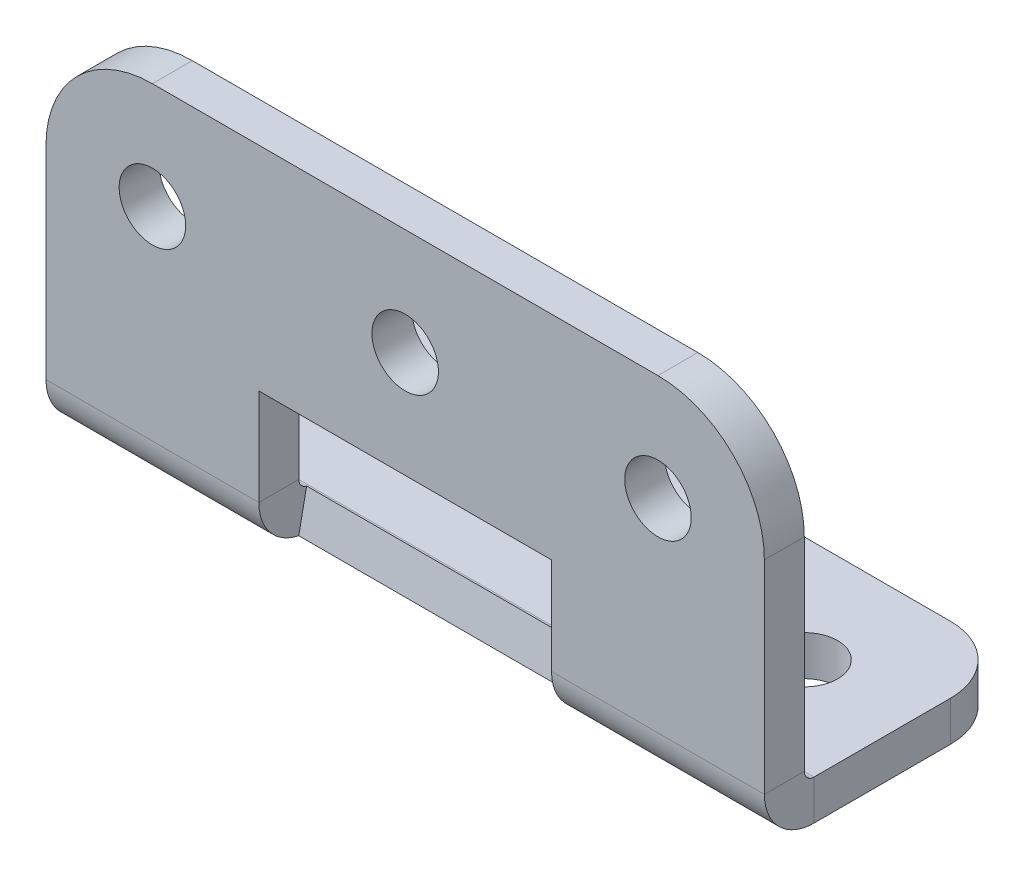
ISO-10303-21;
HEADER;
FILE_DESCRIPTION(('STEP AP214'),'2;1');
FILE_NAME('part.step','',(''),(''),'','','');
FILE_SCHEMA(('AUTOMOTIVE_DESIGN { 1 0 10303 214 1 1 1 1 }'));
ENDSEC;
DATA;
#1=APPLICATION_CONTEXT('core data for automotive mechanical design processes');
#2=APPLICATION_PROTOCOL_DEFINITION('international standard','automotive_design',2000,#1);
#3=PRODUCT_CONTEXT('',#1,'mechanical');
#4=PRODUCT('Part','Part','',(#3));
#5=PRODUCT_RELATED_PRODUCT_CATEGORY('part','',(#4));
#6=PRODUCT_DEFINITION_FORMATION('','',#4);
#7=PRODUCT_DEFINITION_CONTEXT('part definition',#1,'design');
#8=PRODUCT_DEFINITION('design','',#6,#7);
#9=PRODUCT_DEFINITION_SHAPE('','',#8);
#10=(LENGTH_UNIT() NAMED_UNIT(*) SI_UNIT(.MILLI.,.METRE.));
#11=(NAMED_UNIT(*) PLANE_ANGLE_UNIT() SI_UNIT($,.RADIAN.));
#12=(NAMED_UNIT(*) SI_UNIT($,.STERADIAN.) SOLID_ANGLE_UNIT());
#13=UNCERTAINTY_MEASURE_WITH_UNIT(LENGTH_MEASURE(1.E-05),#10,'distance_accuracy_value','');
#14=(GEOMETRIC_REPRESENTATION_CONTEXT(3) GLOBAL_UNCERTAINTY_ASSIGNED_CONTEXT((#13)) GLOBAL_UNIT_ASSIGNED_CONTEXT((#10,
#11,#12)) REPRESENTATION_CONTEXT('',''));
#15=CARTESIAN_POINT('',(0.,0.,0.));
#16=DIRECTION('',(0.,0.,1.));
#17=DIRECTION('',(1.,0.,0.));
#18=AXIS2_PLACEMENT_3D('',#15,#16,#17);
#19=CARTESIAN_POINT('',(54.,24.,3.));
#20=DIRECTION('',(-1.,0.,0.));
#21=DIRECTION('',(0.,0.,1.));
#22=AXIS2_PLACEMENT_3D('',#19,#20,#21);
#23=PLANE('',#22);
#24=DIRECTION('',(0.,0.,1.));
#25=VECTOR('',#24,1.);
#26=CARTESIAN_POINT('',(54.,16.,-7.));
#27=LINE('',#26,#25);
#28=CARTESIAN_POINT('',(54.,16.,3.));
#29=VERTEX_POINT('',#28);
#30=CARTESIAN_POINT('',(54.,16.,0.));
#31=VERTEX_POINT('',#30);
#32=EDGE_CURVE('E86',#29,#31,#27,.F.);
#33=ORIENTED_EDGE('',*,*,#32,.F.);
#34=DIRECTION('',(0.,1.,0.));
#35=VECTOR('',#34,1.);
#36=CARTESIAN_POINT('',(54.,24.,3.));
#37=LINE('',#36,#35);
#38=CARTESIAN_POINT('',(54.,0.736599999999997,3.));
#39=VERTEX_POINT('',#38);
#40=EDGE_CURVE('E250',#39,#29,#37,.T.);
#41=ORIENTED_EDGE('',*,*,#40,.F.);
#42=DIRECTION('',(0.,0.,1.));
#43=VECTOR('',#42,1.);
#44=CARTESIAN_POINT('',(54.,0.736599999999997,0.));
#45=LINE('',#44,#43);
#46=CARTESIAN_POINT('',(54.,0.736599999999997,0.));
#47=VERTEX_POINT('',#46);
#48=EDGE_CURVE('E240',#47,#39,#45,.T.);
#49=ORIENTED_EDGE('',*,*,#48,.F.);
#50=DIRECTION('',(0.,1.,0.));
#51=VECTOR('',#50,1.);
#52=CARTESIAN_POINT('',(54.,24.,0.));
#53=LINE('',#52,#51);
#54=EDGE_CURVE('E259',#47,#31,#53,.T.);
#55=ORIENTED_EDGE('',*,*,#54,.T.);
#56=EDGE_LOOP('',(#33,#41,#49,#55));
#57=FACE_BOUND('',#56,.T.);
#58=ADVANCED_FACE('F77',(#57),#23,.F.);
#59=CARTESIAN_POINT('',(54.,0.736599999999997,-0.736599999999999));
#60=DIRECTION('',(1.,0.,0.));
#61=DIRECTION('',(0.,0.,1.));
#62=AXIS2_PLACEMENT_3D('',#59,#60,#61);
#63=CYLINDRICAL_SURFACE('',#62,3.7366);
#64=DIRECTION('',(-1.,0.,0.));
#65=VECTOR('',#64,1.);
#66=CARTESIAN_POINT('',(38.,-2.92667722128697,0.));
#67=LINE('',#66,#65);
#68=CARTESIAN_POINT('',(38.,-2.92667722128697,0.));
#69=VERTEX_POINT('',#68);
#70=CARTESIAN_POINT('',(16.,-2.92667722128697,0.));
#71=VERTEX_POINT('',#70);
#72=EDGE_CURVE('E366',#69,#71,#67,.T.);
#73=ORIENTED_EDGE('',*,*,#72,.T.);
#74=CARTESIAN_POINT('',(16.,0.736599999999999,-0.736599999999998));
#75=DIRECTION('',(-1.,0.,0.));
#76=DIRECTION('',(0.,0.,1.));
#77=AXIS2_PLACEMENT_3D('',#74,#75,#76);
#78=CIRCLE('',#77,3.7366);
#79=CARTESIAN_POINT('',(16.,0.736600000000011,3.));
#80=VERTEX_POINT('',#79);
#81=EDGE_CURVE('E234',#71,#80,#78,.T.);
#82=ORIENTED_EDGE('',*,*,#81,.T.);
#83=DIRECTION('',(-1.,0.,0.));
#84=VECTOR('',#83,1.);
#85=CARTESIAN_POINT('',(0.,0.736599999999997,3.));
#86=LINE('',#85,#84);
#87=CARTESIAN_POINT('',(0.,0.736599999999997,3.));
#88=VERTEX_POINT('',#87);
#89=EDGE_CURVE('E242',#80,#88,#86,.T.);
#90=ORIENTED_EDGE('',*,*,#89,.T.);
#91=CARTESIAN_POINT('',(0.,0.736599999999997,-0.736599999999999));
#92=DIRECTION('',(1.,0.,0.));
#93=DIRECTION('',(0.,0.,-1.));
#94=AXIS2_PLACEMENT_3D('',#91,#92,#93);
#95=CIRCLE('',#94,3.7366);
#96=CARTESIAN_POINT('',(0.,-3.,-0.736599999999999));
#97=VERTEX_POINT('',#96);
#98=EDGE_CURVE('E267',#97,#88,#95,.F.);
#99=ORIENTED_EDGE('',*,*,#98,.F.);
#100=DIRECTION('',(1.,0.,0.));
#101=VECTOR('',#100,1.);
#102=CARTESIAN_POINT('',(54.,-3.,-0.736599999999998));
#103=LINE('',#102,#101);
#104=CARTESIAN_POINT('',(54.,-3.,-0.736599999999998));
#105=VERTEX_POINT('',#104);
#106=EDGE_CURVE('E264',#105,#97,#103,.F.);
#107=ORIENTED_EDGE('',*,*,#106,.F.);
#108=CARTESIAN_POINT('',(54.,0.736599999999997,-0.736599999999999));
#109=DIRECTION('',(1.,0.,0.));
#110=DIRECTION('',(0.,0.,-1.));
#111=AXIS2_PLACEMENT_3D('',#108,#109,#110);
#112=CIRCLE('',#111,3.7366);
#113=EDGE_CURVE('E268',#39,#105,#112,.T.);
#114=ORIENTED_EDGE('',*,*,#113,.F.);
#115=CARTESIAN_POINT('',(38.,0.73660000000001,3.));
#116=VERTEX_POINT('',#115);
#117=EDGE_CURVE('E244',#39,#116,#86,.T.);
#118=ORIENTED_EDGE('',*,*,#117,.T.);
#119=CARTESIAN_POINT('',(38.,0.736599999999999,-0.736599999999998));
#120=DIRECTION('',(1.,0.,0.));
#121=DIRECTION('',(0.,0.,-1.));
#122=AXIS2_PLACEMENT_3D('',#119,#120,#121);
#123=CIRCLE('',#122,3.7366);
#124=EDGE_CURVE('E358',#116,#69,#123,.T.);
#125=ORIENTED_EDGE('',*,*,#124,.T.);
#126=EDGE_LOOP('',(#73,#82,#90,#99,#107,#114,#118,#125));
#127=FACE_BOUND('',#126,.T.);
#128=ADVANCED_FACE('F376',(#127),#63,.T.);
#129=CARTESIAN_POINT('',(54.,0.736599999999997,-0.736599999999999));
#130=DIRECTION('',(1.,0.,0.));
#131=DIRECTION('',(0.,0.,1.));
#132=AXIS2_PLACEMENT_3D('',#129,#130,#131);
#133=CYLINDRICAL_SURFACE('',#132,0.736599999999999);
#134=CARTESIAN_POINT('',(16.,0.736599999999999,-0.736599999999998));
#135=DIRECTION('',(-1.,0.,0.));
#136=DIRECTION('',(0.,0.,1.));
#137=AXIS2_PLACEMENT_3D('',#134,#135,#136);
#138=CIRCLE('',#137,0.7366);
#139=CARTESIAN_POINT('',(16.,0.0144541986832981,-0.591393245196166));
#140=VERTEX_POINT('',#139);
#141=CARTESIAN_POINT('',(16.,0.736600000000011,0.));
#142=VERTEX_POINT('',#141);
#143=EDGE_CURVE('E369',#140,#142,#138,.T.);
#144=ORIENTED_EDGE('',*,*,#143,.F.);
#145=DIRECTION('',(-1.,0.,0.));
#146=VECTOR('',#145,1.);
#147=CARTESIAN_POINT('',(81.1687528871473,0.0144541986832981,-0.591393245196166));
#148=LINE('',#147,#146);
#149=CARTESIAN_POINT('',(38.,0.0144541986832981,-0.591393245196166));
#150=VERTEX_POINT('',#149);
#151=EDGE_CURVE('E361',#150,#140,#148,.T.);
#152=ORIENTED_EDGE('',*,*,#151,.F.);
#153=CARTESIAN_POINT('',(38.,0.736599999999999,-0.736599999999998));
#154=DIRECTION('',(-1.,0.,0.));
#155=DIRECTION('',(0.,0.,1.));
#156=AXIS2_PLACEMENT_3D('',#153,#154,#155);
#157=CIRCLE('',#156,0.7366);
#158=CARTESIAN_POINT('',(38.,0.736600000000011,0.));
#159=VERTEX_POINT('',#158);
#160=EDGE_CURVE('E353',#159,#150,#157,.F.);
#161=ORIENTED_EDGE('',*,*,#160,.F.);
#162=DIRECTION('',(1.,0.,0.));
#163=VECTOR('',#162,1.);
#164=CARTESIAN_POINT('',(0.,0.736599999999997,0.));
#165=LINE('',#164,#163);
#166=EDGE_CURVE('E232',#159,#47,#165,.T.);
#167=ORIENTED_EDGE('',*,*,#166,.T.);
#168=CARTESIAN_POINT('',(54.,0.736599999999997,-0.736599999999999));
#169=DIRECTION('',(1.,0.,0.));
#170=DIRECTION('',(0.,0.,-1.));
#171=AXIS2_PLACEMENT_3D('',#168,#169,#170);
#172=CIRCLE('',#171,0.736599999999999);
#173=CARTESIAN_POINT('',(54.,0.,-0.736599999999999));
#174=VERTEX_POINT('',#173);
#175=EDGE_CURVE('E257',#47,#174,#172,.T.);
#176=ORIENTED_EDGE('',*,*,#175,.T.);
#177=DIRECTION('',(1.,0.,0.));
#178=VECTOR('',#177,1.);
#179=CARTESIAN_POINT('',(54.,0.,-0.736599999999999));
#180=LINE('',#179,#178);
#181=CARTESIAN_POINT('',(0.,0.,-0.736599999999999));
#182=VERTEX_POINT('',#181);
#183=EDGE_CURVE('E277',#174,#182,#180,.F.);
#184=ORIENTED_EDGE('',*,*,#183,.T.);
#185=CARTESIAN_POINT('',(0.,0.736599999999997,-0.736599999999999));
#186=DIRECTION('',(1.,0.,0.));
#187=DIRECTION('',(0.,0.,-1.));
#188=AXIS2_PLACEMENT_3D('',#185,#186,#187);
#189=CIRCLE('',#188,0.736599999999999);
#190=CARTESIAN_POINT('',(0.,0.736599999999997,0.));
#191=VERTEX_POINT('',#190);
#192=EDGE_CURVE('E274',#182,#191,#189,.F.);
#193=ORIENTED_EDGE('',*,*,#192,.T.);
#194=EDGE_CURVE('E238',#191,#142,#165,.T.);
#195=ORIENTED_EDGE('',*,*,#194,.T.);
#196=EDGE_LOOP('',(#144,#152,#161,#167,#176,#184,#193,#195));
#197=FACE_BOUND('',#196,.T.);
#198=ADVANCED_FACE('F394',(#197),#133,.F.);
#199=CARTESIAN_POINT('',(0.,0.,3.));
#200=DIRECTION('',(0.,0.,-1.));
#201=DIRECTION('',(-1.,0.,0.));
#202=AXIS2_PLACEMENT_3D('',#199,#200,#201);
#203=PLANE('',#202);
#204=CARTESIAN_POINT('',(8.,16.,3.));
#205=DIRECTION('',(0.,0.,1.));
#206=DIRECTION('',(1.,0.,0.));
#207=AXIS2_PLACEMENT_3D('',#204,#205,#206);
#208=CIRCLE('',#207,2.5);
#209=CARTESIAN_POINT('',(10.5,16.,3.));
#210=VERTEX_POINT('',#209);
#211=EDGE_CURVE('E346',#210,#210,#208,.T.);
#212=ORIENTED_EDGE('',*,*,#211,.F.);
#213=EDGE_LOOP('',(#212));
#214=FACE_BOUND('',#213,.T.);
#215=DIRECTION('',(-1.,0.,0.));
#216=VECTOR('',#215,1.);
#217=CARTESIAN_POINT('',(0.,24.,3.));
#218=LINE('',#217,#216);
#219=CARTESIAN_POINT('',(46.,24.,3.));
#220=VERTEX_POINT('',#219);
#221=CARTESIAN_POINT('',(8.,24.,3.));
#222=VERTEX_POINT('',#221);
#223=EDGE_CURVE('E254',#220,#222,#218,.T.);
#224=ORIENTED_EDGE('',*,*,#223,.T.);
#225=CARTESIAN_POINT('',(8.,16.,3.));
#226=DIRECTION('',(0.,0.,1.));
#227=DIRECTION('',(1.,0.,0.));
#228=AXIS2_PLACEMENT_3D('',#225,#226,#227);
#229=CIRCLE('',#228,8.);
#230=CARTESIAN_POINT('',(0.,16.,3.));
#231=VERTEX_POINT('',#230);
#232=EDGE_CURVE('E384',#231,#222,#229,.F.);
#233=ORIENTED_EDGE('',*,*,#232,.F.);
#234=DIRECTION('',(0.,-1.,0.));
#235=VECTOR('',#234,1.);
#236=CARTESIAN_POINT('',(0.,0.,3.));
#237=LINE('',#236,#235);
#238=EDGE_CURVE('E248',#231,#88,#237,.T.);
#239=ORIENTED_EDGE('',*,*,#238,.T.);
#240=ORIENTED_EDGE('',*,*,#89,.F.);
#241=DIRECTION('',(0.,1.,0.));
#242=VECTOR('',#241,1.);
#243=CARTESIAN_POINT('',(16.,-26.,3.));
#244=LINE('',#243,#242);
#245=CARTESIAN_POINT('',(16.,8.00000000000001,3.));
#246=VERTEX_POINT('',#245);
#247=EDGE_CURVE('E229',#80,#246,#244,.T.);
#248=ORIENTED_EDGE('',*,*,#247,.T.);
#249=DIRECTION('',(1.,0.,0.));
#250=VECTOR('',#249,1.);
#251=CARTESIAN_POINT('',(16.,8.00000000000001,3.));
#252=LINE('',#251,#250);
#253=CARTESIAN_POINT('',(38.,8.00000000000001,3.));
#254=VERTEX_POINT('',#253);
#255=EDGE_CURVE('E208',#246,#254,#252,.T.);
#256=ORIENTED_EDGE('',*,*,#255,.T.);
#257=DIRECTION('',(0.,1.,0.));
#258=VECTOR('',#257,1.);
#259=CARTESIAN_POINT('',(38.,-26.,3.));
#260=LINE('',#259,#258);
#261=EDGE_CURVE('E99',#116,#254,#260,.T.);
#262=ORIENTED_EDGE('',*,*,#261,.F.);
#263=ORIENTED_EDGE('',*,*,#117,.F.);
#264=ORIENTED_EDGE('',*,*,#40,.T.);
#265=CARTESIAN_POINT('',(46.,16.,3.));
#266=DIRECTION('',(0.,0.,1.));
#267=DIRECTION('',(1.,0.,0.));
#268=AXIS2_PLACEMENT_3D('',#265,#266,#267);
#269=CIRCLE('',#268,8.);
#270=EDGE_CURVE('E406',#220,#29,#269,.F.);
#271=ORIENTED_EDGE('',*,*,#270,.F.);
#272=EDGE_LOOP('',(#224,#233,#239,#240,#248,#256,#262,#263,#264,#271));
#273=FACE_BOUND('',#272,.T.);
#274=CARTESIAN_POINT('',(46.,16.,3.));
#275=DIRECTION('',(0.,0.,1.));
#276=DIRECTION('',(1.,0.,0.));
#277=AXIS2_PLACEMENT_3D('',#274,#275,#276);
#278=CIRCLE('',#277,2.5);
#279=CARTESIAN_POINT('',(48.5,16.,3.));
#280=VERTEX_POINT('',#279);
#281=EDGE_CURVE('E413',#280,#280,#278,.T.);
#282=ORIENTED_EDGE('',*,*,#281,.F.);
#283=EDGE_LOOP('',(#282));
#284=FACE_BOUND('',#283,.T.);
#285=CARTESIAN_POINT('',(27.,16.,3.));
#286=DIRECTION('',(0.,0.,1.));
#287=DIRECTION('',(1.,0.,0.));
#288=AXIS2_PLACEMENT_3D('',#285,#286,#287);
#289=CIRCLE('',#288,2.5);
#290=CARTESIAN_POINT('',(29.5,16.,3.));
#291=VERTEX_POINT('',#290);
#292=EDGE_CURVE('E637',#291,#291,#289,.T.);
#293=ORIENTED_EDGE('',*,*,#292,.F.);
#294=EDGE_LOOP('',(#293));
#295=FACE_BOUND('',#294,.T.);
#296=ADVANCED_FACE('F380',(#214,#273,#284,#295),#203,.F.);
#297=CARTESIAN_POINT('',(0.,0.,0.));
#298=DIRECTION('',(0.,0.,-1.));
#299=DIRECTION('',(-1.,0.,0.));
#300=AXIS2_PLACEMENT_3D('',#297,#298,#299);
#301=PLANE('',#300);
#302=CARTESIAN_POINT('',(8.,16.,0.));
#303=DIRECTION('',(0.,0.,-1.));
#304=DIRECTION('',(-1.,0.,0.));
#305=AXIS2_PLACEMENT_3D('',#302,#303,#304);
#306=CIRCLE('',#305,8.);
#307=CARTESIAN_POINT('',(8.,24.,0.));
#308=VERTEX_POINT('',#307);
#309=CARTESIAN_POINT('',(0.,16.,0.));
#310=VERTEX_POINT('',#309);
#311=EDGE_CURVE('E337',#308,#310,#306,.F.);
#312=ORIENTED_EDGE('',*,*,#311,.F.);
#313=DIRECTION('',(-1.,0.,0.));
#314=VECTOR('',#313,1.);
#315=CARTESIAN_POINT('',(0.,24.,0.));
#316=LINE('',#315,#314);
#317=CARTESIAN_POINT('',(46.,24.,0.));
#318=VERTEX_POINT('',#317);
#319=EDGE_CURVE('E251',#318,#308,#316,.T.);
#320=ORIENTED_EDGE('',*,*,#319,.F.);
#321=CARTESIAN_POINT('',(46.,16.,0.));
#322=DIRECTION('',(0.,0.,-1.));
#323=DIRECTION('',(-1.,0.,0.));
#324=AXIS2_PLACEMENT_3D('',#321,#322,#323);
#325=CIRCLE('',#324,8.);
#326=EDGE_CURVE('E342',#31,#318,#325,.F.);
#327=ORIENTED_EDGE('',*,*,#326,.F.);
#328=ORIENTED_EDGE('',*,*,#54,.F.);
#329=ORIENTED_EDGE('',*,*,#166,.F.);
#330=DIRECTION('',(0.,1.,0.));
#331=VECTOR('',#330,1.);
#332=CARTESIAN_POINT('',(38.,0.,0.));
#333=LINE('',#332,#331);
#334=CARTESIAN_POINT('',(38.,8.00000000000001,0.));
#335=VERTEX_POINT('',#334);
#336=EDGE_CURVE('E223',#159,#335,#333,.T.);
#337=ORIENTED_EDGE('',*,*,#336,.T.);
#338=DIRECTION('',(1.,0.,0.));
#339=VECTOR('',#338,1.);
#340=CARTESIAN_POINT('',(16.,8.00000000000001,0.));
#341=LINE('',#340,#339);
#342=CARTESIAN_POINT('',(16.,8.00000000000001,0.));
#343=VERTEX_POINT('',#342);
#344=EDGE_CURVE('E206',#343,#335,#341,.T.);
#345=ORIENTED_EDGE('',*,*,#344,.F.);
#346=DIRECTION('',(0.,1.,0.));
#347=VECTOR('',#346,1.);
#348=CARTESIAN_POINT('',(16.,0.,0.));
#349=LINE('',#348,#347);
#350=EDGE_CURVE('E220',#142,#343,#349,.T.);
#351=ORIENTED_EDGE('',*,*,#350,.F.);
#352=ORIENTED_EDGE('',*,*,#194,.F.);
#353=DIRECTION('',(0.,-1.,0.));
#354=VECTOR('',#353,1.);
#355=CARTESIAN_POINT('',(0.,0.,0.));
#356=LINE('',#355,#354);
#357=EDGE_CURVE('E247',#310,#191,#356,.T.);
#358=ORIENTED_EDGE('',*,*,#357,.F.);
#359=EDGE_LOOP('',(#312,#320,#327,#328,#329,#337,#345,#351,#352,#358));
#360=FACE_BOUND('',#359,.T.);
#361=CARTESIAN_POINT('',(8.,16.,0.));
#362=DIRECTION('',(0.,0.,-1.));
#363=DIRECTION('',(-1.,0.,0.));
#364=AXIS2_PLACEMENT_3D('',#361,#362,#363);
#365=CIRCLE('',#364,2.5);
#366=CARTESIAN_POINT('',(5.5,16.,0.));
#367=VERTEX_POINT('',#366);
#368=EDGE_CURVE('E81',#367,#367,#365,.T.);
#369=ORIENTED_EDGE('',*,*,#368,.F.);
#370=EDGE_LOOP('',(#369));
#371=FACE_BOUND('',#370,.T.);
#372=CARTESIAN_POINT('',(46.,16.,0.));
#373=DIRECTION('',(0.,0.,-1.));
#374=DIRECTION('',(-1.,0.,0.));
#375=AXIS2_PLACEMENT_3D('',#372,#373,#374);
#376=CIRCLE('',#375,2.5);
#377=CARTESIAN_POINT('',(43.5,16.,0.));
#378=VERTEX_POINT('',#377);
#379=EDGE_CURVE('E335',#378,#378,#376,.T.);
#380=ORIENTED_EDGE('',*,*,#379,.F.);
#381=EDGE_LOOP('',(#380));
#382=FACE_BOUND('',#381,.T.);
#383=CARTESIAN_POINT('',(27.,16.,0.));
#384=DIRECTION('',(0.,0.,1.));
#385=DIRECTION('',(1.,0.,0.));
#386=AXIS2_PLACEMENT_3D('',#383,#384,#385);
#387=CIRCLE('',#386,2.5);
#388=CARTESIAN_POINT('',(29.5,16.,0.));
#389=VERTEX_POINT('',#388);
#390=EDGE_CURVE('E634',#389,#389,#387,.T.);
#391=ORIENTED_EDGE('',*,*,#390,.T.);
#392=EDGE_LOOP('',(#391));
#393=FACE_BOUND('',#392,.T.);
#394=ADVANCED_FACE('F217',(#360,#371,#382,#393),#301,.T.);
#395=CARTESIAN_POINT('',(0.,24.,3.));
#396=DIRECTION('',(0.,-1.,0.));
#397=DIRECTION('',(0.,0.,-1.));
#398=AXIS2_PLACEMENT_3D('',#395,#396,#397);
#399=PLANE('',#398);
#400=ORIENTED_EDGE('',*,*,#223,.F.);
#401=DIRECTION('',(0.,0.,1.));
#402=VECTOR('',#401,1.);
#403=CARTESIAN_POINT('',(46.,24.,-7.));
#404=LINE('',#403,#402);
#405=EDGE_CURVE('E403',#318,#220,#404,.T.);
#406=ORIENTED_EDGE('',*,*,#405,.F.);
#407=ORIENTED_EDGE('',*,*,#319,.T.);
#408=DIRECTION('',(0.,0.,1.));
#409=VECTOR('',#408,1.);
#410=CARTESIAN_POINT('',(8.,24.,-7.));
#411=LINE('',#410,#409);
#412=EDGE_CURVE('E401',#308,#222,#411,.T.);
#413=ORIENTED_EDGE('',*,*,#412,.T.);
#414=EDGE_LOOP('',(#400,#406,#407,#413));
#415=FACE_BOUND('',#414,.T.);
#416=ADVANCED_FACE('F400',(#415),#399,.F.);
#417=CARTESIAN_POINT('',(54.,-3.,0.));
#418=DIRECTION('',(1.,0.,0.));
#419=DIRECTION('',(0.,0.,-1.));
#420=AXIS2_PLACEMENT_3D('',#417,#418,#419);
#421=PLANE('',#420);
#422=DIRECTION('',(0.,0.,-1.));
#423=VECTOR('',#422,1.);
#424=CARTESIAN_POINT('',(54.,0.,0.));
#425=LINE('',#424,#423);
#426=CARTESIAN_POINT('',(54.,0.,-11.));
#427=VERTEX_POINT('',#426);
#428=EDGE_CURVE('E317',#174,#427,#425,.T.);
#429=ORIENTED_EDGE('',*,*,#428,.F.);
#430=DIRECTION('',(0.,-1.,0.));
#431=VECTOR('',#430,1.);
#432=CARTESIAN_POINT('',(54.,0.,-0.736599999999999));
#433=LINE('',#432,#431);
#434=EDGE_CURVE('E271',#174,#105,#433,.T.);
#435=ORIENTED_EDGE('',*,*,#434,.T.);
#436=DIRECTION('',(0.,0.,-1.));
#437=VECTOR('',#436,1.);
#438=CARTESIAN_POINT('',(54.,-3.,0.));
#439=LINE('',#438,#437);
#440=CARTESIAN_POINT('',(54.,-3.,-11.));
#441=VERTEX_POINT('',#440);
#442=EDGE_CURVE('E302',#105,#441,#439,.T.);
#443=ORIENTED_EDGE('',*,*,#442,.T.);
#444=DIRECTION('',(0.,1.,0.));
#445=VECTOR('',#444,1.);
#446=CARTESIAN_POINT('',(54.,-3.,-11.));
#447=LINE('',#446,#445);
#448=EDGE_CURVE('E314',#441,#427,#447,.T.);
#449=ORIENTED_EDGE('',*,*,#448,.T.);
#450=EDGE_LOOP('',(#429,#435,#443,#449));
#451=FACE_BOUND('',#450,.T.);
#452=ADVANCED_FACE('F460',(#451),#421,.T.);
#453=CARTESIAN_POINT('',(4.99999999999999,-3.,-11.));
#454=DIRECTION('',(0.,-1.,0.));
#455=DIRECTION('',(0.,0.,-1.));
#456=AXIS2_PLACEMENT_3D('',#453,#454,#455);
#457=PLANE('',#456);
#458=CARTESIAN_POINT('',(46.,-3.,-8.00000000000001));
#459=DIRECTION('',(0.,1.,0.));
#460=DIRECTION('',(0.,0.,-1.));
#461=AXIS2_PLACEMENT_3D('',#458,#459,#460);
#462=CIRCLE('',#461,2.5);
#463=CARTESIAN_POINT('',(46.,-3.,-10.5));
#464=VERTEX_POINT('',#463);
#465=EDGE_CURVE('E287',#464,#464,#462,.T.);
#466=ORIENTED_EDGE('',*,*,#465,.T.);
#467=EDGE_LOOP('',(#466));
#468=FACE_BOUND('',#467,.T.);
#469=CARTESIAN_POINT('',(8.,-3.,-8.));
#470=DIRECTION('',(0.,1.,0.));
#471=DIRECTION('',(0.,0.,1.));
#472=AXIS2_PLACEMENT_3D('',#469,#470,#471);
#473=CIRCLE('',#472,2.5);
#474=CARTESIAN_POINT('',(8.,-3.,-5.5));
#475=VERTEX_POINT('',#474);
#476=EDGE_CURVE('E293',#475,#475,#473,.T.);
#477=ORIENTED_EDGE('',*,*,#476,.T.);
#478=EDGE_LOOP('',(#477));
#479=FACE_BOUND('',#478,.T.);
#480=ORIENTED_EDGE('',*,*,#442,.F.);
#481=ORIENTED_EDGE('',*,*,#106,.T.);
#482=DIRECTION('',(0.,0.,1.));
#483=VECTOR('',#482,1.);
#484=CARTESIAN_POINT('',(0.,-3.,0.));
#485=LINE('',#484,#483);
#486=CARTESIAN_POINT('',(0.,-3.,-11.));
#487=VERTEX_POINT('',#486);
#488=EDGE_CURVE('E299',#487,#97,#485,.T.);
#489=ORIENTED_EDGE('',*,*,#488,.F.);
#490=CARTESIAN_POINT('',(4.99999999999999,-3.,-11.));
#491=DIRECTION('',(0.,1.,0.));
#492=DIRECTION('',(0.,0.,-1.));
#493=AXIS2_PLACEMENT_3D('',#490,#491,#492);
#494=CIRCLE('',#493,5.);
#495=CARTESIAN_POINT('',(4.99999999999999,-3.,-16.));
#496=VERTEX_POINT('',#495);
#497=EDGE_CURVE('E311',#496,#487,#494,.T.);
#498=ORIENTED_EDGE('',*,*,#497,.F.);
#499=DIRECTION('',(-1.,0.,0.));
#500=VECTOR('',#499,1.);
#501=CARTESIAN_POINT('',(4.99999999999999,-3.,-16.));
#502=LINE('',#501,#500);
#503=CARTESIAN_POINT('',(49.,-3.,-16.));
#504=VERTEX_POINT('',#503);
#505=EDGE_CURVE('E308',#504,#496,#502,.T.);
#506=ORIENTED_EDGE('',*,*,#505,.F.);
#507=CARTESIAN_POINT('',(49.,-3.,-11.));
#508=DIRECTION('',(0.,1.,0.));
#509=DIRECTION('',(0.,0.,-1.));
#510=AXIS2_PLACEMENT_3D('',#507,#508,#509);
#511=CIRCLE('',#510,5.);
#512=EDGE_CURVE('E305',#441,#504,#511,.T.);
#513=ORIENTED_EDGE('',*,*,#512,.F.);
#514=EDGE_LOOP('',(#480,#481,#489,#498,#506,#513));
#515=FACE_BOUND('',#514,.T.);
#516=ADVANCED_FACE('F456',(#468,#479,#515),#457,.T.);
#517=CARTESIAN_POINT('',(4.99999999999999,0.,-11.));
#518=DIRECTION('',(0.,-1.,0.));
#519=DIRECTION('',(0.,0.,-1.));
#520=AXIS2_PLACEMENT_3D('',#517,#518,#519);
#521=PLANE('',#520);
#522=CARTESIAN_POINT('',(8.,0.,-8.));
#523=DIRECTION('',(0.,1.,0.));
#524=DIRECTION('',(0.,0.,1.));
#525=AXIS2_PLACEMENT_3D('',#522,#523,#524);
#526=CIRCLE('',#525,2.5);
#527=CARTESIAN_POINT('',(8.,0.,-5.5));
#528=VERTEX_POINT('',#527);
#529=EDGE_CURVE('E290',#528,#528,#526,.T.);
#530=ORIENTED_EDGE('',*,*,#529,.F.);
#531=EDGE_LOOP('',(#530));
#532=FACE_BOUND('',#531,.T.);
#533=CARTESIAN_POINT('',(46.,0.,-8.00000000000001));
#534=DIRECTION('',(0.,1.,0.));
#535=DIRECTION('',(0.,0.,-1.));
#536=AXIS2_PLACEMENT_3D('',#533,#534,#535);
#537=CIRCLE('',#536,2.5);
#538=CARTESIAN_POINT('',(46.,0.,-10.5));
#539=VERTEX_POINT('',#538);
#540=EDGE_CURVE('E284',#539,#539,#537,.T.);
#541=ORIENTED_EDGE('',*,*,#540,.F.);
#542=EDGE_LOOP('',(#541));
#543=FACE_BOUND('',#542,.T.);
#544=ORIENTED_EDGE('',*,*,#183,.F.);
#545=ORIENTED_EDGE('',*,*,#428,.T.);
#546=CARTESIAN_POINT('',(49.,0.,-11.));
#547=DIRECTION('',(0.,1.,0.));
#548=DIRECTION('',(0.,0.,-1.));
#549=AXIS2_PLACEMENT_3D('',#546,#547,#548);
#550=CIRCLE('',#549,5.);
#551=CARTESIAN_POINT('',(49.,0.,-16.));
#552=VERTEX_POINT('',#551);
#553=EDGE_CURVE('E319',#427,#552,#550,.T.);
#554=ORIENTED_EDGE('',*,*,#553,.T.);
#555=DIRECTION('',(-1.,0.,0.));
#556=VECTOR('',#555,1.);
#557=CARTESIAN_POINT('',(4.99999999999999,0.,-16.));
#558=LINE('',#557,#556);
#559=CARTESIAN_POINT('',(4.99999999999999,0.,-16.));
#560=VERTEX_POINT('',#559);
#561=EDGE_CURVE('E322',#552,#560,#558,.T.);
#562=ORIENTED_EDGE('',*,*,#561,.T.);
#563=CARTESIAN_POINT('',(4.99999999999999,0.,-11.));
#564=DIRECTION('',(0.,1.,0.));
#565=DIRECTION('',(0.,0.,-1.));
#566=AXIS2_PLACEMENT_3D('',#563,#564,#565);
#567=CIRCLE('',#566,5.);
#568=CARTESIAN_POINT('',(0.,0.,-11.));
#569=VERTEX_POINT('',#568);
#570=EDGE_CURVE('E303',#560,#569,#567,.T.);
#571=ORIENTED_EDGE('',*,*,#570,.T.);
#572=DIRECTION('',(0.,0.,1.));
#573=VECTOR('',#572,1.);
#574=CARTESIAN_POINT('',(0.,0.,0.));
#575=LINE('',#574,#573);
#576=EDGE_CURVE('E296',#569,#182,#575,.T.);
#577=ORIENTED_EDGE('',*,*,#576,.T.);
#578=EDGE_LOOP('',(#544,#545,#554,#562,#571,#577));
#579=FACE_BOUND('',#578,.T.);
#580=ADVANCED_FACE('F459',(#532,#543,#579),#521,.F.);
#581=CARTESIAN_POINT('',(0.,-3.,0.));
#582=DIRECTION('',(-1.,0.,0.));
#583=DIRECTION('',(0.,0.,1.));
#584=AXIS2_PLACEMENT_3D('',#581,#582,#583);
#585=PLANE('',#584);
#586=DIRECTION('',(0.,-1.,0.));
#587=VECTOR('',#586,1.);
#588=CARTESIAN_POINT('',(0.,0.,-0.736599999999999));
#589=LINE('',#588,#587);
#590=EDGE_CURVE('E281',#182,#97,#589,.T.);
#591=ORIENTED_EDGE('',*,*,#590,.F.);
#592=ORIENTED_EDGE('',*,*,#576,.F.);
#593=DIRECTION('',(0.,1.,0.));
#594=VECTOR('',#593,1.);
#595=CARTESIAN_POINT('',(0.,-3.,-11.));
#596=LINE('',#595,#594);
#597=EDGE_CURVE('E327',#487,#569,#596,.T.);
#598=ORIENTED_EDGE('',*,*,#597,.F.);
#599=ORIENTED_EDGE('',*,*,#488,.T.);
#600=EDGE_LOOP('',(#591,#592,#598,#599));
#601=FACE_BOUND('',#600,.T.);
#602=ADVANCED_FACE('F79',(#601),#585,.T.);
#603=CARTESIAN_POINT('',(4.99999999999999,-3.,-11.));
#604=DIRECTION('',(0.,1.,0.));
#605=DIRECTION('',(0.,0.,1.));
#606=AXIS2_PLACEMENT_3D('',#603,#604,#605);
#607=CYLINDRICAL_SURFACE('',#606,5.);
#608=ORIENTED_EDGE('',*,*,#570,.F.);
#609=DIRECTION('',(0.,1.,0.));
#610=VECTOR('',#609,1.);
#611=CARTESIAN_POINT('',(4.99999999999999,-3.,-16.));
#612=LINE('',#611,#610);
#613=EDGE_CURVE('E329',#496,#560,#612,.T.);
#614=ORIENTED_EDGE('',*,*,#613,.F.);
#615=ORIENTED_EDGE('',*,*,#497,.T.);
#616=ORIENTED_EDGE('',*,*,#597,.T.);
#617=EDGE_LOOP('',(#608,#614,#615,#616));
#618=FACE_BOUND('',#617,.T.);
#619=ADVANCED_FACE('F465',(#618),#607,.T.);
#620=CARTESIAN_POINT('',(4.99999999999999,-3.,-16.));
#621=DIRECTION('',(0.,0.,-1.));
#622=DIRECTION('',(-1.,0.,0.));
#623=AXIS2_PLACEMENT_3D('',#620,#621,#622);
#624=PLANE('',#623);
#625=ORIENTED_EDGE('',*,*,#561,.F.);
#626=DIRECTION('',(0.,1.,0.));
#627=VECTOR('',#626,1.);
#628=CARTESIAN_POINT('',(49.,-3.,-16.));
#629=LINE('',#628,#627);
#630=EDGE_CURVE('E331',#504,#552,#629,.T.);
#631=ORIENTED_EDGE('',*,*,#630,.F.);
#632=ORIENTED_EDGE('',*,*,#505,.T.);
#633=ORIENTED_EDGE('',*,*,#613,.T.);
#634=EDGE_LOOP('',(#625,#631,#632,#633));
#635=FACE_BOUND('',#634,.T.);
#636=ADVANCED_FACE('F468',(#635),#624,.T.);
#637=CARTESIAN_POINT('',(49.,-3.,-11.));
#638=DIRECTION('',(0.,1.,0.));
#639=DIRECTION('',(0.,0.,1.));
#640=AXIS2_PLACEMENT_3D('',#637,#638,#639);
#641=CYLINDRICAL_SURFACE('',#640,5.);
#642=ORIENTED_EDGE('',*,*,#553,.F.);
#643=ORIENTED_EDGE('',*,*,#448,.F.);
#644=ORIENTED_EDGE('',*,*,#512,.T.);
#645=ORIENTED_EDGE('',*,*,#630,.T.);
#646=EDGE_LOOP('',(#642,#643,#644,#645));
#647=FACE_BOUND('',#646,.T.);
#648=ADVANCED_FACE('F454',(#647),#641,.T.);
#649=CARTESIAN_POINT('',(8.,-3.,-8.));
#650=DIRECTION('',(0.,1.,0.));
#651=DIRECTION('',(0.,0.,1.));
#652=AXIS2_PLACEMENT_3D('',#649,#650,#651);
#653=CYLINDRICAL_SURFACE('',#652,2.5);
#654=ORIENTED_EDGE('',*,*,#476,.F.);
#655=EDGE_LOOP('',(#654));
#656=FACE_BOUND('',#655,.T.);
#657=ORIENTED_EDGE('',*,*,#529,.T.);
#658=EDGE_LOOP('',(#657));
#659=FACE_BOUND('',#658,.T.);
#660=ADVANCED_FACE('F450',(#656,#659),#653,.F.);
#661=CARTESIAN_POINT('',(46.,-3.,-8.00000000000001));
#662=DIRECTION('',(0.,1.,0.));
#663=DIRECTION('',(0.,0.,1.));
#664=AXIS2_PLACEMENT_3D('',#661,#662,#663);
#665=CYLINDRICAL_SURFACE('',#664,2.5);
#666=ORIENTED_EDGE('',*,*,#465,.F.);
#667=EDGE_LOOP('',(#666));
#668=FACE_BOUND('',#667,.T.);
#669=ORIENTED_EDGE('',*,*,#540,.T.);
#670=EDGE_LOOP('',(#669));
#671=FACE_BOUND('',#670,.T.);
#672=ADVANCED_FACE('F444',(#668,#671),#665,.F.);
#673=CARTESIAN_POINT('',(0.,0.736599999999997,-0.736599999999999));
#674=DIRECTION('',(-1.,0.,0.));
#675=DIRECTION('',(0.,0.,1.));
#676=AXIS2_PLACEMENT_3D('',#673,#674,#675);
#677=PLANE('',#676);
#678=DIRECTION('',(0.,0.,1.));
#679=VECTOR('',#678,1.);
#680=CARTESIAN_POINT('',(0.,0.736599999999997,0.));
#681=LINE('',#680,#679);
#682=EDGE_CURVE('E228',#191,#88,#681,.T.);
#683=ORIENTED_EDGE('',*,*,#682,.F.);
#684=ORIENTED_EDGE('',*,*,#192,.F.);
#685=ORIENTED_EDGE('',*,*,#590,.T.);
#686=ORIENTED_EDGE('',*,*,#98,.T.);
#687=EDGE_LOOP('',(#683,#684,#685,#686));
#688=FACE_BOUND('',#687,.T.);
#689=ADVANCED_FACE('F391',(#688),#677,.T.);
#690=CARTESIAN_POINT('',(54.,0.736599999999997,-0.736599999999999));
#691=DIRECTION('',(-1.,0.,0.));
#692=DIRECTION('',(0.,0.,1.));
#693=AXIS2_PLACEMENT_3D('',#690,#691,#692);
#694=PLANE('',#693);
#695=ORIENTED_EDGE('',*,*,#175,.F.);
#696=ORIENTED_EDGE('',*,*,#48,.T.);
#697=ORIENTED_EDGE('',*,*,#113,.T.);
#698=ORIENTED_EDGE('',*,*,#434,.F.);
#699=EDGE_LOOP('',(#695,#696,#697,#698));
#700=FACE_BOUND('',#699,.T.);
#701=ADVANCED_FACE('F440',(#700),#694,.F.);
#702=CARTESIAN_POINT('',(0.,0.,3.));
#703=DIRECTION('',(1.,0.,0.));
#704=DIRECTION('',(0.,0.,-1.));
#705=AXIS2_PLACEMENT_3D('',#702,#703,#704);
#706=PLANE('',#705);
#707=ORIENTED_EDGE('',*,*,#238,.F.);
#708=DIRECTION('',(0.,0.,1.));
#709=VECTOR('',#708,1.);
#710=CARTESIAN_POINT('',(0.,16.,-7.));
#711=LINE('',#710,#709);
#712=EDGE_CURVE('E12',#231,#310,#711,.F.);
#713=ORIENTED_EDGE('',*,*,#712,.T.);
#714=ORIENTED_EDGE('',*,*,#357,.T.);
#715=ORIENTED_EDGE('',*,*,#682,.T.);
#716=EDGE_LOOP('',(#707,#713,#714,#715));
#717=FACE_BOUND('',#716,.T.);
#718=ADVANCED_FACE('F386',(#717),#706,.F.);
#719=CARTESIAN_POINT('',(16.,-26.,3.));
#720=DIRECTION('',(-1.,0.,0.));
#721=DIRECTION('',(0.,1.,0.));
#722=AXIS2_PLACEMENT_3D('',#719,#720,#721);
#723=PLANE('',#722);
#724=DIRECTION('',(0.,0.,1.));
#725=VECTOR('',#724,1.);
#726=CARTESIAN_POINT('',(16.,8.00000000000001,0.));
#727=LINE('',#726,#725);
#728=EDGE_CURVE('E203',#343,#246,#727,.T.);
#729=ORIENTED_EDGE('',*,*,#728,.T.);
#730=ORIENTED_EDGE('',*,*,#247,.F.);
#731=DIRECTION('',(0.,0.,-1.));
#732=VECTOR('',#731,1.);
#733=CARTESIAN_POINT('',(16.,0.736600000000011,3.));
#734=LINE('',#733,#732);
#735=EDGE_CURVE('E226',#80,#142,#734,.T.);
#736=ORIENTED_EDGE('',*,*,#735,.T.);
#737=ORIENTED_EDGE('',*,*,#350,.T.);
#738=EDGE_LOOP('',(#729,#730,#736,#737));
#739=FACE_BOUND('',#738,.T.);
#740=ADVANCED_FACE('F225',(#739),#723,.F.);
#741=CARTESIAN_POINT('',(16.,0.736599999999999,-0.736599999999998));
#742=DIRECTION('',(1.,0.,0.));
#743=DIRECTION('',(0.,0.,-1.));
#744=AXIS2_PLACEMENT_3D('',#741,#742,#743);
#745=PLANE('',#744);
#746=DIRECTION('',(0.,-0.98037713999009,0.197131081732057));
#747=VECTOR('',#746,1.);
#748=CARTESIAN_POINT('',(16.,-2.92667722128697,0.));
#749=LINE('',#748,#747);
#750=EDGE_CURVE('E364',#140,#71,#749,.T.);
#751=ORIENTED_EDGE('',*,*,#750,.F.);
#752=ORIENTED_EDGE('',*,*,#143,.T.);
#753=ORIENTED_EDGE('',*,*,#735,.F.);
#754=ORIENTED_EDGE('',*,*,#81,.F.);
#755=EDGE_LOOP('',(#751,#752,#753,#754));
#756=FACE_BOUND('',#755,.T.);
#757=ADVANCED_FACE('F520',(#756),#745,.T.);
#758=CARTESIAN_POINT('',(27.,-2.92667722128697,0.));
#759=DIRECTION('',(0.,0.197131081732057,0.98037713999009));
#760=DIRECTION('',(-1.,0.,0.));
#761=AXIS2_PLACEMENT_3D('',#758,#759,#760);
#762=PLANE('',#761);
#763=DIRECTION('',(0.,-0.98037713999009,0.197131081732057));
#764=VECTOR('',#763,1.);
#765=CARTESIAN_POINT('',(38.,-2.92667722128697,0.));
#766=LINE('',#765,#764);
#767=EDGE_CURVE('E356',#150,#69,#766,.T.);
#768=ORIENTED_EDGE('',*,*,#767,.F.);
#769=ORIENTED_EDGE('',*,*,#151,.T.);
#770=ORIENTED_EDGE('',*,*,#750,.T.);
#771=ORIENTED_EDGE('',*,*,#72,.F.);
#772=EDGE_LOOP('',(#768,#769,#770,#771));
#773=FACE_BOUND('',#772,.T.);
#774=ADVANCED_FACE('F513',(#773),#762,.T.);
#775=CARTESIAN_POINT('',(38.,0.736599999999999,-0.736599999999998));
#776=DIRECTION('',(-1.,0.,0.));
#777=DIRECTION('',(0.,0.,1.));
#778=AXIS2_PLACEMENT_3D('',#775,#776,#777);
#779=PLANE('',#778);
#780=DIRECTION('',(0.,0.,-1.));
#781=VECTOR('',#780,1.);
#782=CARTESIAN_POINT('',(38.,0.736600000000011,3.));
#783=LINE('',#782,#781);
#784=EDGE_CURVE('E341',#116,#159,#783,.T.);
#785=ORIENTED_EDGE('',*,*,#784,.T.);
#786=ORIENTED_EDGE('',*,*,#160,.T.);
#787=ORIENTED_EDGE('',*,*,#767,.T.);
#788=ORIENTED_EDGE('',*,*,#124,.F.);
#789=EDGE_LOOP('',(#785,#786,#787,#788));
#790=FACE_BOUND('',#789,.T.);
#791=ADVANCED_FACE('F502',(#790),#779,.T.);
#792=CARTESIAN_POINT('',(38.,-26.,3.));
#793=DIRECTION('',(-1.,0.,0.));
#794=DIRECTION('',(0.,1.,0.));
#795=AXIS2_PLACEMENT_3D('',#792,#793,#794);
#796=PLANE('',#795);
#797=DIRECTION('',(0.,0.,1.));
#798=VECTOR('',#797,1.);
#799=CARTESIAN_POINT('',(38.,8.00000000000001,0.));
#800=LINE('',#799,#798);
#801=EDGE_CURVE('E94',#335,#254,#800,.T.);
#802=ORIENTED_EDGE('',*,*,#801,.F.);
#803=ORIENTED_EDGE('',*,*,#336,.F.);
#804=ORIENTED_EDGE('',*,*,#784,.F.);
#805=ORIENTED_EDGE('',*,*,#261,.T.);
#806=EDGE_LOOP('',(#802,#803,#804,#805));
#807=FACE_BOUND('',#806,.T.);
#808=ADVANCED_FACE('F504',(#807),#796,.T.);
#809=CARTESIAN_POINT('',(46.,16.,-7.));
#810=DIRECTION('',(0.,0.,1.));
#811=DIRECTION('',(1.,0.,0.));
#812=AXIS2_PLACEMENT_3D('',#809,#810,#811);
#813=CYLINDRICAL_SURFACE('',#812,8.);
#814=ORIENTED_EDGE('',*,*,#326,.T.);
#815=ORIENTED_EDGE('',*,*,#405,.T.);
#816=ORIENTED_EDGE('',*,*,#270,.T.);
#817=ORIENTED_EDGE('',*,*,#32,.T.);
#818=EDGE_LOOP('',(#814,#815,#816,#817));
#819=FACE_BOUND('',#818,.T.);
#820=ADVANCED_FACE('F498',(#819),#813,.T.);
#821=CARTESIAN_POINT('',(8.,16.,-7.));
#822=DIRECTION('',(0.,0.,1.));
#823=DIRECTION('',(1.,0.,0.));
#824=AXIS2_PLACEMENT_3D('',#821,#822,#823);
#825=CYLINDRICAL_SURFACE('',#824,8.);
#826=ORIENTED_EDGE('',*,*,#311,.T.);
#827=ORIENTED_EDGE('',*,*,#712,.F.);
#828=ORIENTED_EDGE('',*,*,#232,.T.);
#829=ORIENTED_EDGE('',*,*,#412,.F.);
#830=EDGE_LOOP('',(#826,#827,#828,#829));
#831=FACE_BOUND('',#830,.T.);
#832=ADVANCED_FACE('F511',(#831),#825,.T.);
#833=CARTESIAN_POINT('',(46.,16.,-7.));
#834=DIRECTION('',(0.,0.,1.));
#835=DIRECTION('',(1.,0.,0.));
#836=AXIS2_PLACEMENT_3D('',#833,#834,#835);
#837=CYLINDRICAL_SURFACE('',#836,2.5);
#838=ORIENTED_EDGE('',*,*,#379,.T.);
#839=EDGE_LOOP('',(#838));
#840=FACE_BOUND('',#839,.T.);
#841=ORIENTED_EDGE('',*,*,#281,.T.);
#842=EDGE_LOOP('',(#841));
#843=FACE_BOUND('',#842,.T.);
#844=ADVANCED_FACE('F572',(#840,#843),#837,.F.);
#845=CARTESIAN_POINT('',(8.,16.,-7.));
#846=DIRECTION('',(0.,0.,1.));
#847=DIRECTION('',(1.,0.,0.));
#848=AXIS2_PLACEMENT_3D('',#845,#846,#847);
#849=CYLINDRICAL_SURFACE('',#848,2.5);
#850=ORIENTED_EDGE('',*,*,#368,.T.);
#851=EDGE_LOOP('',(#850));
#852=FACE_BOUND('',#851,.T.);
#853=ORIENTED_EDGE('',*,*,#211,.T.);
#854=EDGE_LOOP('',(#853));
#855=FACE_BOUND('',#854,.T.);
#856=ADVANCED_FACE('F418',(#852,#855),#849,.F.);
#857=CARTESIAN_POINT('',(16.,8.00000000000001,0.));
#858=DIRECTION('',(0.,-1.,0.));
#859=DIRECTION('',(0.,0.,-1.));
#860=AXIS2_PLACEMENT_3D('',#857,#858,#859);
#861=PLANE('',#860);
#862=ORIENTED_EDGE('',*,*,#255,.F.);
#863=ORIENTED_EDGE('',*,*,#728,.F.);
#864=ORIENTED_EDGE('',*,*,#344,.T.);
#865=ORIENTED_EDGE('',*,*,#801,.T.);
#866=EDGE_LOOP('',(#862,#863,#864,#865));
#867=FACE_BOUND('',#866,.T.);
#868=ADVANCED_FACE('F205',(#867),#861,.T.);
#869=CARTESIAN_POINT('',(27.,16.,0.));
#870=DIRECTION('',(0.,0.,1.));
#871=DIRECTION('',(1.,0.,0.));
#872=AXIS2_PLACEMENT_3D('',#869,#870,#871);
#873=CYLINDRICAL_SURFACE('',#872,2.5);
#874=ORIENTED_EDGE('',*,*,#390,.F.);
#875=EDGE_LOOP('',(#874));
#876=FACE_BOUND('',#875,.T.);
#877=ORIENTED_EDGE('',*,*,#292,.T.);
#878=EDGE_LOOP('',(#877));
#879=FACE_BOUND('',#878,.T.);
#880=ADVANCED_FACE('F619',(#876,#879),#873,.F.);
#881=CLOSED_SHELL('',(#58,#128,#198,#296,#394,#416,#452,#516,#580,#602,#619,#636,#648,#660,#672,
#689,#701,#718,#740,#757,#774,#791,#808,#820,#832,#844,#856,#868,#880));
#882=MANIFOLD_SOLID_BREP('B2',#881);
#883=ADVANCED_BREP_SHAPE_REPRESENTATION('',(#18,#882),#14);
#884=SHAPE_DEFINITION_REPRESENTATION(#9,#883);
ENDSEC;
END-ISO-10303-21;
